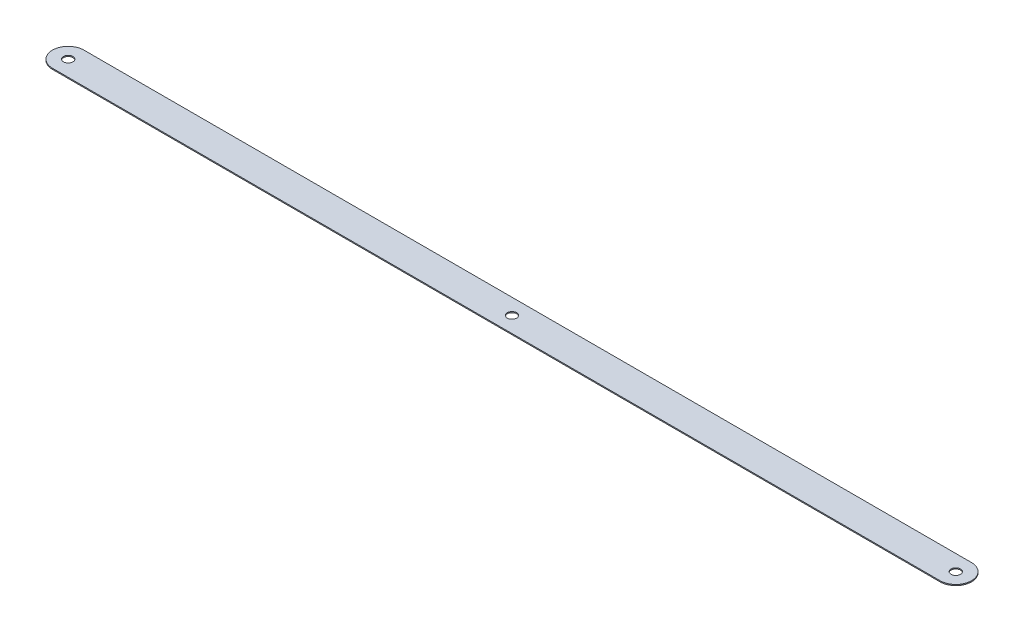
ISO-10303-21;
HEADER;
FILE_DESCRIPTION(('STEP AP214'),'2;1');
FILE_NAME('part.step','',(''),(''),'','','');
FILE_SCHEMA(('AUTOMOTIVE_DESIGN { 1 0 10303 214 1 1 1 1 }'));
ENDSEC;
DATA;
#1=APPLICATION_CONTEXT('core data for automotive mechanical design processes');
#2=APPLICATION_PROTOCOL_DEFINITION('international standard','automotive_design',2000,#1);
#3=PRODUCT_CONTEXT('',#1,'mechanical');
#4=PRODUCT('Part','Part','',(#3));
#5=PRODUCT_RELATED_PRODUCT_CATEGORY('part','',(#4));
#6=PRODUCT_DEFINITION_FORMATION('','',#4);
#7=PRODUCT_DEFINITION_CONTEXT('part definition',#1,'design');
#8=PRODUCT_DEFINITION('design','',#6,#7);
#9=PRODUCT_DEFINITION_SHAPE('','',#8);
#10=(LENGTH_UNIT() NAMED_UNIT(*) SI_UNIT(.MILLI.,.METRE.));
#11=(NAMED_UNIT(*) PLANE_ANGLE_UNIT() SI_UNIT($,.RADIAN.));
#12=(NAMED_UNIT(*) SI_UNIT($,.STERADIAN.) SOLID_ANGLE_UNIT());
#13=UNCERTAINTY_MEASURE_WITH_UNIT(LENGTH_MEASURE(1.E-05),#10,'distance_accuracy_value','');
#14=(GEOMETRIC_REPRESENTATION_CONTEXT(3) GLOBAL_UNCERTAINTY_ASSIGNED_CONTEXT((#13)) GLOBAL_UNIT_ASSIGNED_CONTEXT((#10,
#11,#12)) REPRESENTATION_CONTEXT('',''));
#15=CARTESIAN_POINT('',(0.,0.,0.));
#16=DIRECTION('',(0.,0.,1.));
#17=DIRECTION('',(1.,0.,0.));
#18=AXIS2_PLACEMENT_3D('',#15,#16,#17);
#19=CARTESIAN_POINT('',(-423.5,0.,0.));
#20=DIRECTION('',(0.,1.,0.));
#21=DIRECTION('',(0.,0.,1.));
#22=AXIS2_PLACEMENT_3D('',#19,#20,#21);
#23=PLANE('',#22);
#24=CARTESIAN_POINT('',(423.5,0.,0.));
#25=DIRECTION('',(0.,1.,0.));
#26=DIRECTION('',(0.,0.,1.));
#27=AXIS2_PLACEMENT_3D('',#24,#25,#26);
#28=CIRCLE('',#27,15.);
#29=CARTESIAN_POINT('',(423.5,0.,-15.0000000000002));
#30=VERTEX_POINT('',#29);
#31=CARTESIAN_POINT('',(423.5,0.,14.9999999999999));
#32=VERTEX_POINT('',#31);
#33=EDGE_CURVE('E57',#30,#32,#28,.F.);
#34=ORIENTED_EDGE('',*,*,#33,.F.);
#35=DIRECTION('',(-1.,0.,0.));
#36=VECTOR('',#35,1.);
#37=CARTESIAN_POINT('',(-423.5,0.,-15.));
#38=LINE('',#37,#36);
#39=CARTESIAN_POINT('',(-423.5,0.,-15.));
#40=VERTEX_POINT('',#39);
#41=EDGE_CURVE('E52',#40,#30,#38,.F.);
#42=ORIENTED_EDGE('',*,*,#41,.F.);
#43=CARTESIAN_POINT('',(-423.5,0.,0.));
#44=DIRECTION('',(0.,1.,0.));
#45=DIRECTION('',(0.,0.,1.));
#46=AXIS2_PLACEMENT_3D('',#43,#44,#45);
#47=CIRCLE('',#46,15.);
#48=CARTESIAN_POINT('',(-423.5,0.,15.));
#49=VERTEX_POINT('',#48);
#50=EDGE_CURVE('E70',#49,#40,#47,.F.);
#51=ORIENTED_EDGE('',*,*,#50,.F.);
#52=DIRECTION('',(1.,0.,0.));
#53=VECTOR('',#52,1.);
#54=CARTESIAN_POINT('',(-423.5,0.,15.));
#55=LINE('',#54,#53);
#56=EDGE_CURVE('E66',#32,#49,#55,.F.);
#57=ORIENTED_EDGE('',*,*,#56,.F.);
#58=EDGE_LOOP('',(#34,#42,#51,#57));
#59=FACE_BOUND('',#58,.T.);
#60=CARTESIAN_POINT('',(-423.5,0.,0.));
#61=DIRECTION('',(0.,1.,0.));
#62=DIRECTION('',(0.,0.,1.));
#63=AXIS2_PLACEMENT_3D('',#60,#61,#62);
#64=CIRCLE('',#63,4.50000000000002);
#65=CARTESIAN_POINT('',(-423.5,0.,4.50000000000002));
#66=VERTEX_POINT('',#65);
#67=EDGE_CURVE('E74',#66,#66,#64,.F.);
#68=ORIENTED_EDGE('',*,*,#67,.T.);
#69=EDGE_LOOP('',(#68));
#70=FACE_BOUND('',#69,.T.);
#71=CARTESIAN_POINT('',(0.,0.,0.));
#72=DIRECTION('',(0.,1.,0.));
#73=DIRECTION('',(0.,0.,1.));
#74=AXIS2_PLACEMENT_3D('',#71,#72,#73);
#75=CIRCLE('',#74,4.5);
#76=CARTESIAN_POINT('',(0.,0.,4.5));
#77=VERTEX_POINT('',#76);
#78=EDGE_CURVE('E98',#77,#77,#75,.F.);
#79=ORIENTED_EDGE('',*,*,#78,.T.);
#80=EDGE_LOOP('',(#79));
#81=FACE_BOUND('',#80,.T.);
#82=CARTESIAN_POINT('',(423.5,0.,0.));
#83=DIRECTION('',(0.,1.,0.));
#84=DIRECTION('',(0.,0.,1.));
#85=AXIS2_PLACEMENT_3D('',#82,#83,#84);
#86=CIRCLE('',#85,4.50000000000002);
#87=CARTESIAN_POINT('',(423.5,0.,4.50000000000002));
#88=VERTEX_POINT('',#87);
#89=EDGE_CURVE('E19',#88,#88,#86,.F.);
#90=ORIENTED_EDGE('',*,*,#89,.T.);
#91=EDGE_LOOP('',(#90));
#92=FACE_BOUND('',#91,.T.);
#93=ADVANCED_FACE('F16',(#59,#70,#81,#92),#23,.T.);
#94=CARTESIAN_POINT('',(423.5,-1.,0.));
#95=DIRECTION('',(0.,1.,0.));
#96=DIRECTION('',(0.,0.,1.));
#97=AXIS2_PLACEMENT_3D('',#94,#95,#96);
#98=CYLINDRICAL_SURFACE('',#97,4.50000000000002);
#99=CARTESIAN_POINT('',(423.5,-1.,0.));
#100=DIRECTION('',(0.,1.,0.));
#101=DIRECTION('',(0.,0.,1.));
#102=AXIS2_PLACEMENT_3D('',#99,#100,#101);
#103=CIRCLE('',#102,4.50000000000002);
#104=CARTESIAN_POINT('',(423.5,-1.,4.50000000000002));
#105=VERTEX_POINT('',#104);
#106=EDGE_CURVE('E92',#105,#105,#103,.F.);
#107=ORIENTED_EDGE('',*,*,#106,.T.);
#108=EDGE_LOOP('',(#107));
#109=FACE_BOUND('',#108,.T.);
#110=ORIENTED_EDGE('',*,*,#89,.F.);
#111=EDGE_LOOP('',(#110));
#112=FACE_BOUND('',#111,.T.);
#113=ADVANCED_FACE('F106',(#109,#112),#98,.F.);
#114=CARTESIAN_POINT('',(0.,-1.,0.));
#115=DIRECTION('',(0.,1.,0.));
#116=DIRECTION('',(0.,0.,1.));
#117=AXIS2_PLACEMENT_3D('',#114,#115,#116);
#118=CYLINDRICAL_SURFACE('',#117,4.5);
#119=CARTESIAN_POINT('',(0.,-1.,0.));
#120=DIRECTION('',(0.,1.,0.));
#121=DIRECTION('',(0.,0.,1.));
#122=AXIS2_PLACEMENT_3D('',#119,#120,#121);
#123=CIRCLE('',#122,4.5);
#124=CARTESIAN_POINT('',(0.,-1.,4.5));
#125=VERTEX_POINT('',#124);
#126=EDGE_CURVE('E89',#125,#125,#123,.F.);
#127=ORIENTED_EDGE('',*,*,#126,.T.);
#128=EDGE_LOOP('',(#127));
#129=FACE_BOUND('',#128,.T.);
#130=ORIENTED_EDGE('',*,*,#78,.F.);
#131=EDGE_LOOP('',(#130));
#132=FACE_BOUND('',#131,.T.);
#133=ADVANCED_FACE('F108',(#129,#132),#118,.F.);
#134=CARTESIAN_POINT('',(-423.5,-1.,0.));
#135=DIRECTION('',(0.,1.,0.));
#136=DIRECTION('',(0.,0.,1.));
#137=AXIS2_PLACEMENT_3D('',#134,#135,#136);
#138=CYLINDRICAL_SURFACE('',#137,4.50000000000002);
#139=CARTESIAN_POINT('',(-423.5,-1.,0.));
#140=DIRECTION('',(0.,1.,0.));
#141=DIRECTION('',(0.,0.,1.));
#142=AXIS2_PLACEMENT_3D('',#139,#140,#141);
#143=CIRCLE('',#142,4.50000000000002);
#144=CARTESIAN_POINT('',(-423.5,-1.,4.50000000000002));
#145=VERTEX_POINT('',#144);
#146=EDGE_CURVE('E86',#145,#145,#143,.F.);
#147=ORIENTED_EDGE('',*,*,#146,.T.);
#148=EDGE_LOOP('',(#147));
#149=FACE_BOUND('',#148,.T.);
#150=ORIENTED_EDGE('',*,*,#67,.F.);
#151=EDGE_LOOP('',(#150));
#152=FACE_BOUND('',#151,.T.);
#153=ADVANCED_FACE('F115',(#149,#152),#138,.F.);
#154=CARTESIAN_POINT('',(-423.5,-1.,15.));
#155=DIRECTION('',(0.,0.,1.));
#156=DIRECTION('',(1.,0.,0.));
#157=AXIS2_PLACEMENT_3D('',#154,#155,#156);
#158=PLANE('',#157);
#159=DIRECTION('',(1.,0.,0.));
#160=VECTOR('',#159,1.);
#161=CARTESIAN_POINT('',(-423.5,-1.,15.));
#162=LINE('',#161,#160);
#163=CARTESIAN_POINT('',(-423.5,-1.,15.));
#164=VERTEX_POINT('',#163);
#165=CARTESIAN_POINT('',(423.5,-1.,15.));
#166=VERTEX_POINT('',#165);
#167=EDGE_CURVE('E78',#164,#166,#162,.T.);
#168=ORIENTED_EDGE('',*,*,#167,.T.);
#169=DIRECTION('',(0.,1.,0.));
#170=VECTOR('',#169,1.);
#171=CARTESIAN_POINT('',(423.5,-1.,15.));
#172=LINE('',#171,#170);
#173=EDGE_CURVE('E62',#32,#166,#172,.F.);
#174=ORIENTED_EDGE('',*,*,#173,.F.);
#175=ORIENTED_EDGE('',*,*,#56,.T.);
#176=DIRECTION('',(0.,1.,0.));
#177=VECTOR('',#176,1.);
#178=CARTESIAN_POINT('',(-423.5,-1.,15.));
#179=LINE('',#178,#177);
#180=EDGE_CURVE('E95',#164,#49,#179,.T.);
#181=ORIENTED_EDGE('',*,*,#180,.F.);
#182=EDGE_LOOP('',(#168,#174,#175,#181));
#183=FACE_BOUND('',#182,.T.);
#184=ADVANCED_FACE('F77',(#183),#158,.T.);
#185=CARTESIAN_POINT('',(423.5,-1.,0.));
#186=DIRECTION('',(0.,1.,0.));
#187=DIRECTION('',(0.,0.,1.));
#188=AXIS2_PLACEMENT_3D('',#185,#186,#187);
#189=CYLINDRICAL_SURFACE('',#188,15.);
#190=CARTESIAN_POINT('',(423.5,-1.,0.));
#191=DIRECTION('',(0.,1.,0.));
#192=DIRECTION('',(0.,0.,1.));
#193=AXIS2_PLACEMENT_3D('',#190,#191,#192);
#194=CIRCLE('',#193,15.);
#195=CARTESIAN_POINT('',(423.5,-1.,-15.0000000000002));
#196=VERTEX_POINT('',#195);
#197=EDGE_CURVE('E84',#166,#196,#194,.T.);
#198=ORIENTED_EDGE('',*,*,#197,.T.);
#199=DIRECTION('',(0.,1.,0.));
#200=VECTOR('',#199,1.);
#201=CARTESIAN_POINT('',(423.5,-1.,-15.0000000000002));
#202=LINE('',#201,#200);
#203=EDGE_CURVE('E64',#30,#196,#202,.F.);
#204=ORIENTED_EDGE('',*,*,#203,.F.);
#205=ORIENTED_EDGE('',*,*,#33,.T.);
#206=ORIENTED_EDGE('',*,*,#173,.T.);
#207=EDGE_LOOP('',(#198,#204,#205,#206));
#208=FACE_BOUND('',#207,.T.);
#209=ADVANCED_FACE('F60',(#208),#189,.T.);
#210=CARTESIAN_POINT('',(-423.5,-1.,-15.));
#211=DIRECTION('',(0.,0.,-1.));
#212=DIRECTION('',(-1.,0.,0.));
#213=AXIS2_PLACEMENT_3D('',#210,#211,#212);
#214=PLANE('',#213);
#215=DIRECTION('',(1.,0.,0.));
#216=VECTOR('',#215,1.);
#217=CARTESIAN_POINT('',(-423.5,-1.,-15.0000000000002));
#218=LINE('',#217,#216);
#219=CARTESIAN_POINT('',(-423.5,-1.,-15.0000000000001));
#220=VERTEX_POINT('',#219);
#221=EDGE_CURVE('E25',#196,#220,#218,.F.);
#222=ORIENTED_EDGE('',*,*,#221,.T.);
#223=DIRECTION('',(0.,1.,0.));
#224=VECTOR('',#223,1.);
#225=CARTESIAN_POINT('',(-423.5,-1.,-15.));
#226=LINE('',#225,#224);
#227=EDGE_CURVE('E33',#40,#220,#226,.F.);
#228=ORIENTED_EDGE('',*,*,#227,.F.);
#229=ORIENTED_EDGE('',*,*,#41,.T.);
#230=ORIENTED_EDGE('',*,*,#203,.T.);
#231=EDGE_LOOP('',(#222,#228,#229,#230));
#232=FACE_BOUND('',#231,.T.);
#233=ADVANCED_FACE('F127',(#232),#214,.T.);
#234=CARTESIAN_POINT('',(-423.5,-1.,0.));
#235=DIRECTION('',(0.,1.,0.));
#236=DIRECTION('',(0.,0.,1.));
#237=AXIS2_PLACEMENT_3D('',#234,#235,#236);
#238=CYLINDRICAL_SURFACE('',#237,15.);
#239=CARTESIAN_POINT('',(-423.5,-1.,0.));
#240=DIRECTION('',(0.,1.,0.));
#241=DIRECTION('',(0.,0.,1.));
#242=AXIS2_PLACEMENT_3D('',#239,#240,#241);
#243=CIRCLE('',#242,15.);
#244=EDGE_CURVE('E11',#220,#164,#243,.T.);
#245=ORIENTED_EDGE('',*,*,#244,.T.);
#246=ORIENTED_EDGE('',*,*,#180,.T.);
#247=ORIENTED_EDGE('',*,*,#50,.T.);
#248=ORIENTED_EDGE('',*,*,#227,.T.);
#249=EDGE_LOOP('',(#245,#246,#247,#248));
#250=FACE_BOUND('',#249,.T.);
#251=ADVANCED_FACE('F121',(#250),#238,.T.);
#252=CARTESIAN_POINT('',(-423.5,-1.,0.));
#253=DIRECTION('',(0.,1.,0.));
#254=DIRECTION('',(0.,0.,1.));
#255=AXIS2_PLACEMENT_3D('',#252,#253,#254);
#256=PLANE('',#255);
#257=ORIENTED_EDGE('',*,*,#221,.F.);
#258=ORIENTED_EDGE('',*,*,#197,.F.);
#259=ORIENTED_EDGE('',*,*,#167,.F.);
#260=ORIENTED_EDGE('',*,*,#244,.F.);
#261=EDGE_LOOP('',(#257,#258,#259,#260));
#262=FACE_BOUND('',#261,.T.);
#263=ORIENTED_EDGE('',*,*,#146,.F.);
#264=EDGE_LOOP('',(#263));
#265=FACE_BOUND('',#264,.T.);
#266=ORIENTED_EDGE('',*,*,#126,.F.);
#267=EDGE_LOOP('',(#266));
#268=FACE_BOUND('',#267,.T.);
#269=ORIENTED_EDGE('',*,*,#106,.F.);
#270=EDGE_LOOP('',(#269));
#271=FACE_BOUND('',#270,.T.);
#272=ADVANCED_FACE('F119',(#262,#265,#268,#271),#256,.F.);
#273=CLOSED_SHELL('',(#93,#113,#133,#153,#184,#209,#233,#251,#272));
#274=MANIFOLD_SOLID_BREP('B1',#273);
#275=ADVANCED_BREP_SHAPE_REPRESENTATION('',(#18,#274),#14);
#276=SHAPE_DEFINITION_REPRESENTATION(#9,#275);
ENDSEC;
END-ISO-10303-21;
